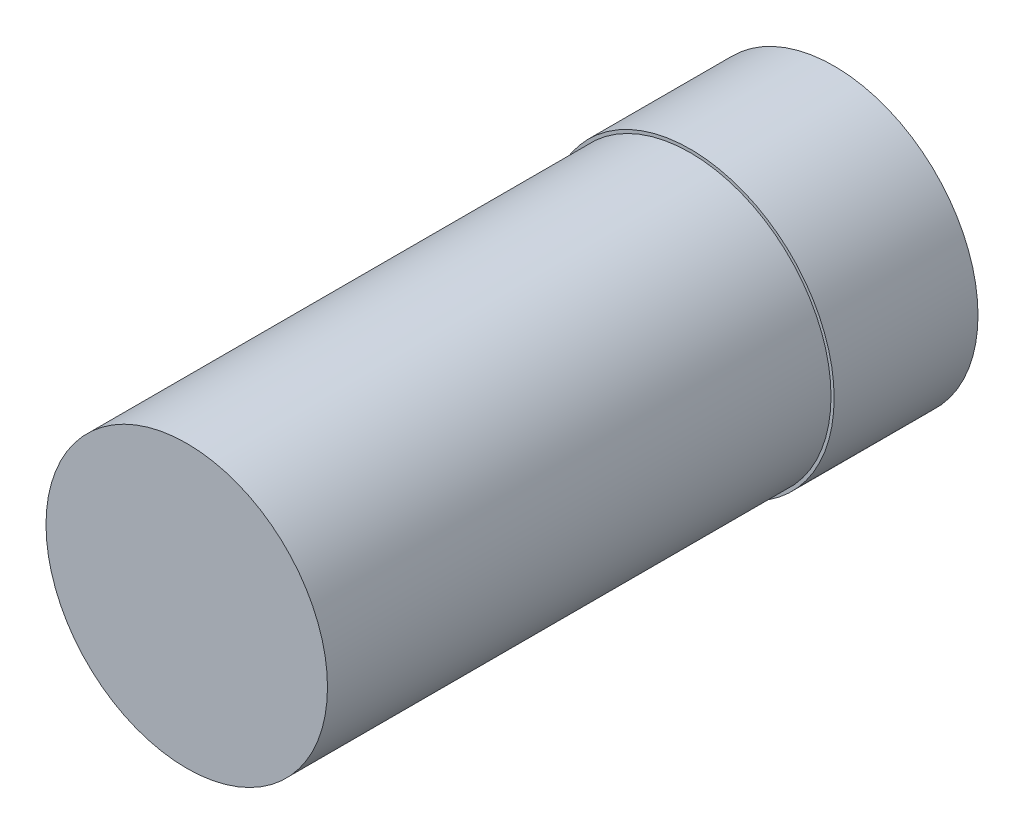
ISO-10303-21;
HEADER;
FILE_DESCRIPTION(('STEP AP214'),'2;1');
FILE_NAME('part.step','',(''),(''),'','','');
FILE_SCHEMA(('AUTOMOTIVE_DESIGN { 1 0 10303 214 1 1 1 1 }'));
ENDSEC;
DATA;
#1=APPLICATION_CONTEXT('core data for automotive mechanical design processes');
#2=APPLICATION_PROTOCOL_DEFINITION('international standard','automotive_design',2000,#1);
#3=PRODUCT_CONTEXT('',#1,'mechanical');
#4=PRODUCT('Part','Part','',(#3));
#5=PRODUCT_RELATED_PRODUCT_CATEGORY('part','',(#4));
#6=PRODUCT_DEFINITION_FORMATION('','',#4);
#7=PRODUCT_DEFINITION_CONTEXT('part definition',#1,'design');
#8=PRODUCT_DEFINITION('design','',#6,#7);
#9=PRODUCT_DEFINITION_SHAPE('','',#8);
#10=(LENGTH_UNIT() NAMED_UNIT(*) SI_UNIT(.MILLI.,.METRE.));
#11=(NAMED_UNIT(*) PLANE_ANGLE_UNIT() SI_UNIT($,.RADIAN.));
#12=(NAMED_UNIT(*) SI_UNIT($,.STERADIAN.) SOLID_ANGLE_UNIT());
#13=UNCERTAINTY_MEASURE_WITH_UNIT(LENGTH_MEASURE(1.E-05),#10,'distance_accuracy_value','');
#14=(GEOMETRIC_REPRESENTATION_CONTEXT(3) GLOBAL_UNCERTAINTY_ASSIGNED_CONTEXT((#13)) GLOBAL_UNIT_ASSIGNED_CONTEXT((#10,
#11,#12)) REPRESENTATION_CONTEXT('',''));
#15=CARTESIAN_POINT('',(0.,0.,0.));
#16=DIRECTION('',(0.,0.,1.));
#17=DIRECTION('',(1.,0.,0.));
#18=AXIS2_PLACEMENT_3D('',#15,#16,#17);
#19=CARTESIAN_POINT('',(0.,0.,3.));
#20=DIRECTION('',(0.,0.,-1.));
#21=DIRECTION('',(-1.,0.,0.));
#22=AXIS2_PLACEMENT_3D('',#19,#20,#21);
#23=CYLINDRICAL_SURFACE('',#22,3.);
#24=CARTESIAN_POINT('',(0.,0.,3.));
#25=DIRECTION('',(0.,0.,1.));
#26=DIRECTION('',(1.,0.,0.));
#27=AXIS2_PLACEMENT_3D('',#24,#25,#26);
#28=CIRCLE('',#27,3.);
#29=CARTESIAN_POINT('',(3.,0.,3.));
#30=VERTEX_POINT('',#29);
#31=EDGE_CURVE('E10',#30,#30,#28,.T.);
#32=ORIENTED_EDGE('',*,*,#31,.F.);
#33=EDGE_LOOP('',(#32));
#34=FACE_BOUND('',#33,.T.);
#35=CARTESIAN_POINT('',(0.,0.,0.));
#36=DIRECTION('',(0.,0.,1.));
#37=DIRECTION('',(1.,0.,0.));
#38=AXIS2_PLACEMENT_3D('',#35,#36,#37);
#39=CIRCLE('',#38,3.);
#40=CARTESIAN_POINT('',(3.,0.,0.));
#41=VERTEX_POINT('',#40);
#42=EDGE_CURVE('E34',#41,#41,#39,.T.);
#43=ORIENTED_EDGE('',*,*,#42,.T.);
#44=EDGE_LOOP('',(#43));
#45=FACE_BOUND('',#44,.T.);
#46=ADVANCED_FACE('F31',(#34,#45),#23,.T.);
#47=CARTESIAN_POINT('',(0.,0.,3.));
#48=DIRECTION('',(0.,0.,1.));
#49=DIRECTION('',(1.,0.,0.));
#50=AXIS2_PLACEMENT_3D('',#47,#48,#49);
#51=PLANE('',#50);
#52=CARTESIAN_POINT('',(0.,0.,3.));
#53=DIRECTION('',(0.,0.,1.));
#54=DIRECTION('',(1.,0.,0.));
#55=AXIS2_PLACEMENT_3D('',#52,#53,#54);
#56=CIRCLE('',#55,2.935);
#57=CARTESIAN_POINT('',(-2.935,0.,3.));
#58=VERTEX_POINT('',#57);
#59=EDGE_CURVE('E43',#58,#58,#56,.T.);
#60=ORIENTED_EDGE('',*,*,#59,.F.);
#61=EDGE_LOOP('',(#60));
#62=FACE_BOUND('',#61,.T.);
#63=ORIENTED_EDGE('',*,*,#31,.T.);
#64=EDGE_LOOP('',(#63));
#65=FACE_BOUND('',#64,.T.);
#66=ADVANCED_FACE('F58',(#62,#65),#51,.T.);
#67=CARTESIAN_POINT('',(0.,0.,0.));
#68=DIRECTION('',(0.,0.,1.));
#69=DIRECTION('',(1.,0.,0.));
#70=AXIS2_PLACEMENT_3D('',#67,#68,#69);
#71=PLANE('',#70);
#72=ORIENTED_EDGE('',*,*,#42,.F.);
#73=EDGE_LOOP('',(#72));
#74=FACE_BOUND('',#73,.T.);
#75=ADVANCED_FACE('F54',(#74),#71,.F.);
#76=CARTESIAN_POINT('',(0.,0.,13.5));
#77=DIRECTION('',(0.,0.,-1.));
#78=DIRECTION('',(-1.,0.,0.));
#79=AXIS2_PLACEMENT_3D('',#76,#77,#78);
#80=CYLINDRICAL_SURFACE('',#79,2.935);
#81=CARTESIAN_POINT('',(0.,0.,13.5));
#82=DIRECTION('',(0.,0.,1.));
#83=DIRECTION('',(1.,0.,0.));
#84=AXIS2_PLACEMENT_3D('',#81,#82,#83);
#85=CIRCLE('',#84,2.935);
#86=CARTESIAN_POINT('',(-2.935,0.,13.5));
#87=VERTEX_POINT('',#86);
#88=EDGE_CURVE('E41',#87,#87,#85,.T.);
#89=CARTESIAN_POINT('',(-2.935,0.,13.5));
#90=CARTESIAN_POINT('',(-2.935,0.,13.390625));
#91=CARTESIAN_POINT('',(-2.935,0.,13.28125));
#92=CARTESIAN_POINT('',(-2.935,0.,13.0625));
#93=CARTESIAN_POINT('',(-2.935,0.,12.953125));
#94=CARTESIAN_POINT('',(-2.935,0.,12.734375));
#95=CARTESIAN_POINT('',(-2.935,0.,12.625));
#96=CARTESIAN_POINT('',(-2.935,0.,12.40625));
#97=CARTESIAN_POINT('',(-2.935,0.,12.296875));
#98=CARTESIAN_POINT('',(-2.935,0.,12.078125));
#99=CARTESIAN_POINT('',(-2.935,0.,11.96875));
#100=CARTESIAN_POINT('',(-2.935,0.,11.75));
#101=CARTESIAN_POINT('',(-2.935,0.,11.640625));
#102=CARTESIAN_POINT('',(-2.935,0.,11.421875));
#103=CARTESIAN_POINT('',(-2.935,0.,11.3125));
#104=CARTESIAN_POINT('',(-2.935,0.,11.09375));
#105=CARTESIAN_POINT('',(-2.935,0.,10.984375));
#106=CARTESIAN_POINT('',(-2.935,0.,10.765625));
#107=CARTESIAN_POINT('',(-2.935,0.,10.65625));
#108=CARTESIAN_POINT('',(-2.935,0.,10.4375));
#109=CARTESIAN_POINT('',(-2.935,0.,10.328125));
#110=CARTESIAN_POINT('',(-2.935,0.,10.109375));
#111=CARTESIAN_POINT('',(-2.935,0.,10.));
#112=CARTESIAN_POINT('',(-2.935,0.,9.78125));
#113=CARTESIAN_POINT('',(-2.935,0.,9.671875));
#114=CARTESIAN_POINT('',(-2.935,0.,9.453125));
#115=CARTESIAN_POINT('',(-2.935,0.,9.34375));
#116=CARTESIAN_POINT('',(-2.935,0.,9.125));
#117=CARTESIAN_POINT('',(-2.935,0.,9.015625));
#118=CARTESIAN_POINT('',(-2.935,0.,8.796875));
#119=CARTESIAN_POINT('',(-2.935,0.,8.6875));
#120=CARTESIAN_POINT('',(-2.935,0.,8.46875));
#121=CARTESIAN_POINT('',(-2.935,0.,8.359375));
#122=CARTESIAN_POINT('',(-2.935,0.,8.140625));
#123=CARTESIAN_POINT('',(-2.935,0.,8.03125));
#124=CARTESIAN_POINT('',(-2.935,0.,7.8125));
#125=CARTESIAN_POINT('',(-2.935,0.,7.703125));
#126=CARTESIAN_POINT('',(-2.935,0.,7.484375));
#127=CARTESIAN_POINT('',(-2.935,0.,7.375));
#128=CARTESIAN_POINT('',(-2.935,0.,7.15625));
#129=CARTESIAN_POINT('',(-2.935,0.,7.046875));
#130=CARTESIAN_POINT('',(-2.935,0.,6.828125));
#131=CARTESIAN_POINT('',(-2.935,0.,6.71875));
#132=CARTESIAN_POINT('',(-2.935,0.,6.5));
#133=CARTESIAN_POINT('',(-2.935,0.,6.390625));
#134=CARTESIAN_POINT('',(-2.935,0.,6.171875));
#135=CARTESIAN_POINT('',(-2.935,0.,6.0625));
#136=CARTESIAN_POINT('',(-2.935,0.,5.84375));
#137=CARTESIAN_POINT('',(-2.935,0.,5.734375));
#138=CARTESIAN_POINT('',(-2.935,0.,5.515625));
#139=CARTESIAN_POINT('',(-2.935,0.,5.40625));
#140=CARTESIAN_POINT('',(-2.935,0.,5.1875));
#141=CARTESIAN_POINT('',(-2.935,0.,5.078125));
#142=CARTESIAN_POINT('',(-2.935,0.,4.859375));
#143=CARTESIAN_POINT('',(-2.935,0.,4.75));
#144=CARTESIAN_POINT('',(-2.935,0.,4.53125));
#145=CARTESIAN_POINT('',(-2.935,0.,4.421875));
#146=CARTESIAN_POINT('',(-2.935,0.,4.203125));
#147=CARTESIAN_POINT('',(-2.935,0.,4.09375));
#148=CARTESIAN_POINT('',(-2.935,0.,3.875));
#149=CARTESIAN_POINT('',(-2.935,0.,3.765625));
#150=CARTESIAN_POINT('',(-2.935,0.,3.546875));
#151=CARTESIAN_POINT('',(-2.935,0.,3.4375));
#152=CARTESIAN_POINT('',(-2.935,0.,3.21875));
#153=CARTESIAN_POINT('',(-2.935,0.,3.109375));
#154=CARTESIAN_POINT('',(-2.935,0.,3.));
#155=B_SPLINE_CURVE_WITH_KNOTS('',3,(#89,#90,#91,#92,#93,#94,#95,#96,#97,#98,#99,#100,#101,#102,
#103,#104,#105,#106,#107,#108,#109,#110,#111,#112,#113,#114,#115,#116,#117,#118,#119,#120,#121,
#122,#123,#124,#125,#126,#127,#128,#129,#130,#131,#132,#133,#134,#135,#136,#137,#138,#139,#140,
#141,#142,#143,#144,#145,#146,#147,#148,#149,#150,#151,#152,#153,#154),.UNSPECIFIED.,.F.,.F.,(4,
2,2,2,2,2,2,2,2,2,2,2,2,2,2,2,2,2,2,2,2,2,2,2,2,2,2,2,2,2,2,2,4),(0.,0.328124999999999,
0.656249999999999,0.984374999999999,1.3125,1.640625,1.96875,2.296875,2.625,2.953125,3.28125,
3.609375,3.9375,4.265625,4.59375,4.921875,5.25,5.578125,5.90625,6.234375,6.5625,6.890625,
7.21875,7.546875,7.875,8.203125,8.53125,8.859375,9.1875,9.515625,9.84375,10.171875,10.5),.UNSPECIFIED.);
#156=EDGE_CURVE('BSEAM51',#87,#58,#155,.T.);
#157=ORIENTED_EDGE('',*,*,#88,.F.);
#158=ORIENTED_EDGE('',*,*,#59,.T.);
#159=ORIENTED_EDGE('',*,*,#156,.T.);
#160=ORIENTED_EDGE('',*,*,#156,.F.);
#161=EDGE_LOOP('',(#157,#159,#158,#160));
#162=FACE_BOUND('',#161,.T.);
#163=ADVANCED_FACE('F51',(#162),#80,.T.);
#164=CARTESIAN_POINT('',(0.,0.,13.5));
#165=DIRECTION('',(0.,0.,1.));
#166=DIRECTION('',(1.,0.,0.));
#167=AXIS2_PLACEMENT_3D('',#164,#165,#166);
#168=PLANE('',#167);
#169=ORIENTED_EDGE('',*,*,#88,.T.);
#170=EDGE_LOOP('',(#169));
#171=FACE_BOUND('',#170,.T.);
#172=ADVANCED_FACE('F49',(#171),#168,.T.);
#173=CLOSED_SHELL('',(#46,#66,#75,#163,#172));
#174=MANIFOLD_SOLID_BREP('B2',#173);
#175=ADVANCED_BREP_SHAPE_REPRESENTATION('',(#18,#174),#14);
#176=SHAPE_DEFINITION_REPRESENTATION(#9,#175);
ENDSEC;
END-ISO-10303-21;
